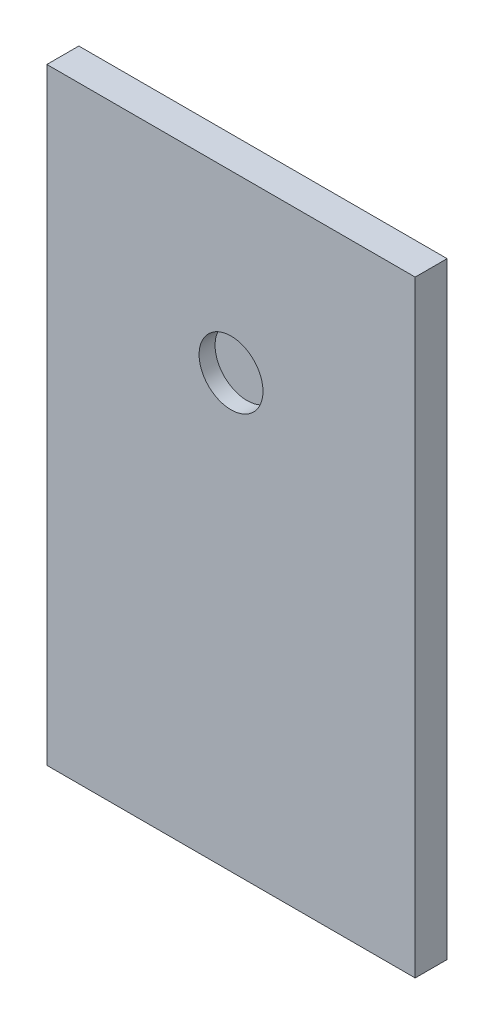
ISO-10303-21;
HEADER;
FILE_DESCRIPTION(('STEP AP214'),'2;1');
FILE_NAME('part.step','',(''),(''),'','','');
FILE_SCHEMA(('AUTOMOTIVE_DESIGN { 1 0 10303 214 1 1 1 1 }'));
ENDSEC;
DATA;
#1=APPLICATION_CONTEXT('core data for automotive mechanical design processes');
#2=APPLICATION_PROTOCOL_DEFINITION('international standard','automotive_design',2000,#1);
#3=PRODUCT_CONTEXT('',#1,'mechanical');
#4=PRODUCT('Part','Part','',(#3));
#5=PRODUCT_RELATED_PRODUCT_CATEGORY('part','',(#4));
#6=PRODUCT_DEFINITION_FORMATION('','',#4);
#7=PRODUCT_DEFINITION_CONTEXT('part definition',#1,'design');
#8=PRODUCT_DEFINITION('design','',#6,#7);
#9=PRODUCT_DEFINITION_SHAPE('','',#8);
#10=(LENGTH_UNIT() NAMED_UNIT(*) SI_UNIT(.MILLI.,.METRE.));
#11=(NAMED_UNIT(*) PLANE_ANGLE_UNIT() SI_UNIT($,.RADIAN.));
#12=(NAMED_UNIT(*) SI_UNIT($,.STERADIAN.) SOLID_ANGLE_UNIT());
#13=UNCERTAINTY_MEASURE_WITH_UNIT(LENGTH_MEASURE(1.E-05),#10,'distance_accuracy_value','');
#14=(GEOMETRIC_REPRESENTATION_CONTEXT(3) GLOBAL_UNCERTAINTY_ASSIGNED_CONTEXT((#13)) GLOBAL_UNIT_ASSIGNED_CONTEXT((#10,
#11,#12)) REPRESENTATION_CONTEXT('',''));
#15=CARTESIAN_POINT('',(0.,0.,0.));
#16=DIRECTION('',(0.,0.,1.));
#17=DIRECTION('',(1.,0.,0.));
#18=AXIS2_PLACEMENT_3D('',#15,#16,#17);
#19=CARTESIAN_POINT('',(28.82,62.5,5.));
#20=DIRECTION('',(-1.,0.,0.));
#21=DIRECTION('',(0.,-1.,0.));
#22=AXIS2_PLACEMENT_3D('',#19,#20,#21);
#23=PLANE('',#22);
#24=DIRECTION('',(0.,1.,0.));
#25=VECTOR('',#24,1.);
#26=CARTESIAN_POINT('',(28.82,62.5,0.));
#27=LINE('',#26,#25);
#28=CARTESIAN_POINT('',(28.82,-62.5,0.));
#29=VERTEX_POINT('',#28);
#30=CARTESIAN_POINT('',(28.82,32.5,0.));
#31=VERTEX_POINT('',#30);
#32=EDGE_CURVE('E96',#29,#31,#27,.T.);
#33=ORIENTED_EDGE('',*,*,#32,.T.);
#34=DIRECTION('',(0.,0.,1.));
#35=VECTOR('',#34,1.);
#36=CARTESIAN_POINT('',(28.82,32.5,-5.));
#37=LINE('',#36,#35);
#38=CARTESIAN_POINT('',(28.82,32.5,5.));
#39=VERTEX_POINT('',#38);
#40=EDGE_CURVE('E60',#31,#39,#37,.T.);
#41=ORIENTED_EDGE('',*,*,#40,.T.);
#42=DIRECTION('',(0.,1.,0.));
#43=VECTOR('',#42,1.);
#44=CARTESIAN_POINT('',(28.82,62.5,5.));
#45=LINE('',#44,#43);
#46=CARTESIAN_POINT('',(28.82,-62.5,5.));
#47=VERTEX_POINT('',#46);
#48=EDGE_CURVE('E91',#47,#39,#45,.T.);
#49=ORIENTED_EDGE('',*,*,#48,.F.);
#50=DIRECTION('',(0.,0.,-1.));
#51=VECTOR('',#50,1.);
#52=CARTESIAN_POINT('',(28.82,-62.5,5.));
#53=LINE('',#52,#51);
#54=EDGE_CURVE('E84',#47,#29,#53,.T.);
#55=ORIENTED_EDGE('',*,*,#54,.T.);
#56=EDGE_LOOP('',(#33,#41,#49,#55));
#57=FACE_BOUND('',#56,.T.);
#58=ADVANCED_FACE('F45',(#57),#23,.F.);
#59=CARTESIAN_POINT('',(-28.82,62.5,5.));
#60=DIRECTION('',(1.,0.,0.));
#61=DIRECTION('',(0.,1.,0.));
#62=AXIS2_PLACEMENT_3D('',#59,#60,#61);
#63=PLANE('',#62);
#64=DIRECTION('',(0.,-1.,0.));
#65=VECTOR('',#64,1.);
#66=CARTESIAN_POINT('',(-28.82,62.5,5.));
#67=LINE('',#66,#65);
#68=CARTESIAN_POINT('',(-28.82,32.5,5.));
#69=VERTEX_POINT('',#68);
#70=CARTESIAN_POINT('',(-28.82,-62.5,5.));
#71=VERTEX_POINT('',#70);
#72=EDGE_CURVE('E114',#69,#71,#67,.T.);
#73=ORIENTED_EDGE('',*,*,#72,.F.);
#74=DIRECTION('',(0.,0.,1.));
#75=VECTOR('',#74,1.);
#76=CARTESIAN_POINT('',(-28.82,32.5,-5.));
#77=LINE('',#76,#75);
#78=CARTESIAN_POINT('',(-28.82,32.5,0.));
#79=VERTEX_POINT('',#78);
#80=EDGE_CURVE('E123',#79,#69,#77,.T.);
#81=ORIENTED_EDGE('',*,*,#80,.F.);
#82=DIRECTION('',(0.,-1.,0.));
#83=VECTOR('',#82,1.);
#84=CARTESIAN_POINT('',(-28.82,62.5,0.));
#85=LINE('',#84,#83);
#86=CARTESIAN_POINT('',(-28.82,-62.5,0.));
#87=VERTEX_POINT('',#86);
#88=EDGE_CURVE('E92',#79,#87,#85,.T.);
#89=ORIENTED_EDGE('',*,*,#88,.T.);
#90=DIRECTION('',(0.,0.,-1.));
#91=VECTOR('',#90,1.);
#92=CARTESIAN_POINT('',(-28.82,-62.5,5.));
#93=LINE('',#92,#91);
#94=EDGE_CURVE('E53',#71,#87,#93,.T.);
#95=ORIENTED_EDGE('',*,*,#94,.F.);
#96=EDGE_LOOP('',(#73,#81,#89,#95));
#97=FACE_BOUND('',#96,.T.);
#98=ADVANCED_FACE('F140',(#97),#63,.F.);
#99=CARTESIAN_POINT('',(-28.82,-62.5,5.));
#100=DIRECTION('',(0.,1.,0.));
#101=DIRECTION('',(0.,0.,1.));
#102=AXIS2_PLACEMENT_3D('',#99,#100,#101);
#103=PLANE('',#102);
#104=DIRECTION('',(1.,0.,0.));
#105=VECTOR('',#104,1.);
#106=CARTESIAN_POINT('',(-28.82,-62.5,0.));
#107=LINE('',#106,#105);
#108=EDGE_CURVE('E81',#87,#29,#107,.T.);
#109=ORIENTED_EDGE('',*,*,#108,.T.);
#110=ORIENTED_EDGE('',*,*,#54,.F.);
#111=DIRECTION('',(1.,0.,0.));
#112=VECTOR('',#111,1.);
#113=CARTESIAN_POINT('',(-28.82,-62.5,5.));
#114=LINE('',#113,#112);
#115=EDGE_CURVE('E68',#71,#47,#114,.T.);
#116=ORIENTED_EDGE('',*,*,#115,.F.);
#117=ORIENTED_EDGE('',*,*,#94,.T.);
#118=EDGE_LOOP('',(#109,#110,#116,#117));
#119=FACE_BOUND('',#118,.T.);
#120=ADVANCED_FACE('F83',(#119),#103,.F.);
#121=CARTESIAN_POINT('',(0.,0.,5.));
#122=DIRECTION('',(0.,0.,1.));
#123=DIRECTION('',(1.,0.,0.));
#124=AXIS2_PLACEMENT_3D('',#121,#122,#123);
#125=PLANE('',#124);
#126=DIRECTION('',(1.,0.,0.));
#127=VECTOR('',#126,1.);
#128=CARTESIAN_POINT('',(-28.82,32.5,5.));
#129=LINE('',#128,#127);
#130=EDGE_CURVE('E127',#69,#39,#129,.T.);
#131=ORIENTED_EDGE('',*,*,#130,.F.);
#132=ORIENTED_EDGE('',*,*,#72,.T.);
#133=ORIENTED_EDGE('',*,*,#115,.T.);
#134=ORIENTED_EDGE('',*,*,#48,.T.);
#135=EDGE_LOOP('',(#131,#132,#133,#134));
#136=FACE_BOUND('',#135,.T.);
#137=CARTESIAN_POINT('',(0.,5.10170356,5.));
#138=DIRECTION('',(0.,0.,1.));
#139=DIRECTION('',(1.,0.,0.));
#140=AXIS2_PLACEMENT_3D('',#137,#138,#139);
#141=CIRCLE('',#140,5.);
#142=CARTESIAN_POINT('',(4.99999999999999,5.10170356,5.));
#143=VERTEX_POINT('',#142);
#144=EDGE_CURVE('E107',#143,#143,#141,.F.);
#145=ORIENTED_EDGE('',*,*,#144,.T.);
#146=EDGE_LOOP('',(#145));
#147=FACE_BOUND('',#146,.T.);
#148=ADVANCED_FACE('F136',(#136,#147),#125,.T.);
#149=CARTESIAN_POINT('',(0.,0.,0.));
#150=DIRECTION('',(0.,0.,1.));
#151=DIRECTION('',(1.,0.,0.));
#152=AXIS2_PLACEMENT_3D('',#149,#150,#151);
#153=PLANE('',#152);
#154=ORIENTED_EDGE('',*,*,#88,.F.);
#155=DIRECTION('',(1.,0.,0.));
#156=VECTOR('',#155,1.);
#157=CARTESIAN_POINT('',(0.,32.5,0.));
#158=LINE('',#157,#156);
#159=EDGE_CURVE('E11',#79,#31,#158,.T.);
#160=ORIENTED_EDGE('',*,*,#159,.T.);
#161=ORIENTED_EDGE('',*,*,#32,.F.);
#162=ORIENTED_EDGE('',*,*,#108,.F.);
#163=EDGE_LOOP('',(#154,#160,#161,#162));
#164=FACE_BOUND('',#163,.T.);
#165=ADVANCED_FACE('F99',(#164),#153,.F.);
#166=CARTESIAN_POINT('',(0.,5.10170356,2.5));
#167=DIRECTION('',(0.,0.,1.));
#168=DIRECTION('',(1.,0.,0.));
#169=AXIS2_PLACEMENT_3D('',#166,#167,#168);
#170=CYLINDRICAL_SURFACE('',#169,5.);
#171=CARTESIAN_POINT('',(0.,5.10170356,2.5));
#172=DIRECTION('',(0.,0.,1.));
#173=DIRECTION('',(1.,0.,0.));
#174=AXIS2_PLACEMENT_3D('',#171,#172,#173);
#175=CIRCLE('',#174,5.);
#176=CARTESIAN_POINT('',(4.99999999999999,5.10170356,2.5));
#177=VERTEX_POINT('',#176);
#178=EDGE_CURVE('E101',#177,#177,#175,.F.);
#179=ORIENTED_EDGE('',*,*,#178,.T.);
#180=EDGE_LOOP('',(#179));
#181=FACE_BOUND('',#180,.T.);
#182=ORIENTED_EDGE('',*,*,#144,.F.);
#183=EDGE_LOOP('',(#182));
#184=FACE_BOUND('',#183,.T.);
#185=ADVANCED_FACE('F150',(#181,#184),#170,.F.);
#186=CARTESIAN_POINT('',(0.,0.,2.5));
#187=DIRECTION('',(0.,0.,1.));
#188=DIRECTION('',(1.,0.,0.));
#189=AXIS2_PLACEMENT_3D('',#186,#187,#188);
#190=PLANE('',#189);
#191=ORIENTED_EDGE('',*,*,#178,.F.);
#192=EDGE_LOOP('',(#191));
#193=FACE_BOUND('',#192,.T.);
#194=ADVANCED_FACE('F155',(#193),#190,.T.);
#195=CARTESIAN_POINT('',(-28.82,32.5,-5.));
#196=DIRECTION('',(0.,-1.,0.));
#197=DIRECTION('',(1.,0.,0.));
#198=AXIS2_PLACEMENT_3D('',#195,#196,#197);
#199=PLANE('',#198);
#200=ORIENTED_EDGE('',*,*,#80,.T.);
#201=ORIENTED_EDGE('',*,*,#130,.T.);
#202=ORIENTED_EDGE('',*,*,#40,.F.);
#203=ORIENTED_EDGE('',*,*,#159,.F.);
#204=EDGE_LOOP('',(#200,#201,#202,#203));
#205=FACE_BOUND('',#204,.T.);
#206=ADVANCED_FACE('F131',(#205),#199,.F.);
#207=CLOSED_SHELL('',(#58,#98,#120,#148,#165,#185,#194,#206));
#208=MANIFOLD_SOLID_BREP('B2',#207);
#209=ADVANCED_BREP_SHAPE_REPRESENTATION('',(#18,#208),#14);
#210=SHAPE_DEFINITION_REPRESENTATION(#9,#209);
ENDSEC;
END-ISO-10303-21;
